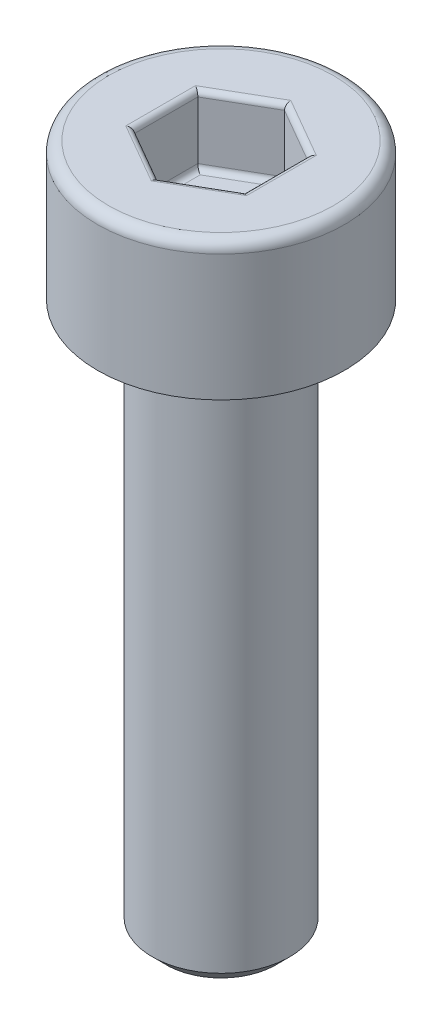
ISO-10303-21;
HEADER;
FILE_DESCRIPTION(('STEP AP214'),'2;1');
FILE_NAME('part.step','',(''),(''),'','','');
FILE_SCHEMA(('AUTOMOTIVE_DESIGN { 1 0 10303 214 1 1 1 1 }'));
ENDSEC;
DATA;
#1=APPLICATION_CONTEXT('core data for automotive mechanical design processes');
#2=APPLICATION_PROTOCOL_DEFINITION('international standard','automotive_design',2000,#1);
#3=PRODUCT_CONTEXT('',#1,'mechanical');
#4=PRODUCT('Part','Part','',(#3));
#5=PRODUCT_RELATED_PRODUCT_CATEGORY('part','',(#4));
#6=PRODUCT_DEFINITION_FORMATION('','',#4);
#7=PRODUCT_DEFINITION_CONTEXT('part definition',#1,'design');
#8=PRODUCT_DEFINITION('design','',#6,#7);
#9=PRODUCT_DEFINITION_SHAPE('','',#8);
#10=(LENGTH_UNIT() NAMED_UNIT(*) SI_UNIT(.MILLI.,.METRE.));
#11=(NAMED_UNIT(*) PLANE_ANGLE_UNIT() SI_UNIT($,.RADIAN.));
#12=(NAMED_UNIT(*) SI_UNIT($,.STERADIAN.) SOLID_ANGLE_UNIT());
#13=UNCERTAINTY_MEASURE_WITH_UNIT(LENGTH_MEASURE(1.E-05),#10,'distance_accuracy_value','');
#14=(GEOMETRIC_REPRESENTATION_CONTEXT(3) GLOBAL_UNCERTAINTY_ASSIGNED_CONTEXT((#13)) GLOBAL_UNIT_ASSIGNED_CONTEXT((#10,
#11,#12)) REPRESENTATION_CONTEXT('',''));
#15=CARTESIAN_POINT('',(0.,0.,0.));
#16=DIRECTION('',(0.,0.,1.));
#17=DIRECTION('',(1.,0.,0.));
#18=AXIS2_PLACEMENT_3D('',#15,#16,#17);
#19=CARTESIAN_POINT('',(0.,-12.5,0.));
#20=DIRECTION('',(0.,-1.,0.));
#21=DIRECTION('',(0.,0.,-1.));
#22=AXIS2_PLACEMENT_3D('',#19,#20,#21);
#23=PLANE('',#22);
#24=CARTESIAN_POINT('',(0.,-12.5,0.));
#25=DIRECTION('',(0.,-1.,0.));
#26=DIRECTION('',(0.,0.,-1.));
#27=AXIS2_PLACEMENT_3D('',#24,#25,#26);
#28=CIRCLE('',#27,0.999999999999992);
#29=CARTESIAN_POINT('',(0.,-12.5,-0.999999999999992));
#30=VERTEX_POINT('',#29);
#31=EDGE_CURVE('E262',#30,#30,#28,.T.);
#32=ORIENTED_EDGE('',*,*,#31,.T.);
#33=EDGE_LOOP('',(#32));
#34=FACE_BOUND('',#33,.T.);
#35=ADVANCED_FACE('F34',(#34),#23,.T.);
#36=CARTESIAN_POINT('',(0.,0.,0.));
#37=DIRECTION('',(0.,1.,0.));
#38=DIRECTION('',(0.,0.,1.));
#39=AXIS2_PLACEMENT_3D('',#36,#37,#38);
#40=CYLINDRICAL_SURFACE('',#39,1.25);
#41=CARTESIAN_POINT('',(0.,-2.75,0.));
#42=DIRECTION('',(0.,-1.,0.));
#43=DIRECTION('',(0.,0.,-1.));
#44=AXIS2_PLACEMENT_3D('',#41,#42,#43);
#45=CIRCLE('',#44,1.25);
#46=CARTESIAN_POINT('',(0.,-2.75,-1.25));
#47=VERTEX_POINT('',#46);
#48=EDGE_CURVE('E259',#47,#47,#45,.T.);
#49=ORIENTED_EDGE('',*,*,#48,.T.);
#50=EDGE_LOOP('',(#49));
#51=FACE_BOUND('',#50,.T.);
#52=CARTESIAN_POINT('',(0.,-12.25,0.));
#53=DIRECTION('',(0.,-1.,0.));
#54=DIRECTION('',(0.,0.,-1.));
#55=AXIS2_PLACEMENT_3D('',#52,#53,#54);
#56=CIRCLE('',#55,1.25);
#57=CARTESIAN_POINT('',(0.,-12.25,-1.25));
#58=VERTEX_POINT('',#57);
#59=EDGE_CURVE('E256',#58,#58,#56,.F.);
#60=ORIENTED_EDGE('',*,*,#59,.T.);
#61=EDGE_LOOP('',(#60));
#62=FACE_BOUND('',#61,.T.);
#63=ADVANCED_FACE('F288',(#51,#62),#40,.T.);
#64=CARTESIAN_POINT('',(-1.25,-2.5,0.));
#65=DIRECTION('',(0.,-1.,0.));
#66=DIRECTION('',(0.,0.,-1.));
#67=AXIS2_PLACEMENT_3D('',#64,#65,#66);
#68=PLANE('',#67);
#69=CARTESIAN_POINT('',(0.,-2.5,0.));
#70=DIRECTION('',(0.,-1.,0.));
#71=DIRECTION('',(0.,0.,-1.));
#72=AXIS2_PLACEMENT_3D('',#69,#70,#71);
#73=CIRCLE('',#72,1.5);
#74=CARTESIAN_POINT('',(0.,-2.5,-1.5));
#75=VERTEX_POINT('',#74);
#76=EDGE_CURVE('E253',#75,#75,#73,.F.);
#77=ORIENTED_EDGE('',*,*,#76,.T.);
#78=EDGE_LOOP('',(#77));
#79=FACE_BOUND('',#78,.T.);
#80=CARTESIAN_POINT('',(0.,-2.5,0.));
#81=DIRECTION('',(0.,1.,0.));
#82=DIRECTION('',(0.,0.,1.));
#83=AXIS2_PLACEMENT_3D('',#80,#81,#82);
#84=CIRCLE('',#83,2.25);
#85=CARTESIAN_POINT('',(0.,-2.5,2.25));
#86=VERTEX_POINT('',#85);
#87=EDGE_CURVE('E250',#86,#86,#84,.T.);
#88=ORIENTED_EDGE('',*,*,#87,.F.);
#89=EDGE_LOOP('',(#88));
#90=FACE_BOUND('',#89,.T.);
#91=ADVANCED_FACE('F294',(#79,#90),#68,.T.);
#92=CARTESIAN_POINT('',(0.,0.,0.));
#93=DIRECTION('',(0.,1.,0.));
#94=DIRECTION('',(0.,0.,1.));
#95=AXIS2_PLACEMENT_3D('',#92,#93,#94);
#96=CYLINDRICAL_SURFACE('',#95,2.25);
#97=CARTESIAN_POINT('',(0.,-0.2,0.));
#98=DIRECTION('',(0.,1.,0.));
#99=DIRECTION('',(0.,0.,1.));
#100=AXIS2_PLACEMENT_3D('',#97,#98,#99);
#101=CIRCLE('',#100,2.25);
#102=CARTESIAN_POINT('',(0.,-0.2,2.25));
#103=VERTEX_POINT('',#102);
#104=EDGE_CURVE('E160',#103,#103,#101,.F.);
#105=ORIENTED_EDGE('',*,*,#104,.T.);
#106=EDGE_LOOP('',(#105));
#107=FACE_BOUND('',#106,.T.);
#108=ORIENTED_EDGE('',*,*,#87,.T.);
#109=EDGE_LOOP('',(#108));
#110=FACE_BOUND('',#109,.T.);
#111=ADVANCED_FACE('F304',(#107,#110),#96,.T.);
#112=CARTESIAN_POINT('',(-2.25,0.,0.));
#113=DIRECTION('',(0.,1.,0.));
#114=DIRECTION('',(0.,0.,1.));
#115=AXIS2_PLACEMENT_3D('',#112,#113,#114);
#116=PLANE('',#115);
#117=DIRECTION('',(0.,0.,1.));
#118=VECTOR('',#117,1.);
#119=CARTESIAN_POINT('',(-1.1,0.,-0.577350269189627));
#120=LINE('',#119,#118);
#121=CARTESIAN_POINT('',(-1.1,0.,0.635085296108588));
#122=VERTEX_POINT('',#121);
#123=CARTESIAN_POINT('',(-1.1,0.,-0.635085296108589));
#124=VERTEX_POINT('',#123);
#125=EDGE_CURVE('E176',#122,#124,#120,.F.);
#126=ORIENTED_EDGE('',*,*,#125,.T.);
#127=DIRECTION('',(-0.866025403784439,0.,0.5));
#128=VECTOR('',#127,1.);
#129=CARTESIAN_POINT('',(-0.0500000000000009,0.,-1.2413030787577));
#130=LINE('',#129,#128);
#131=CARTESIAN_POINT('',(0.,0.,-1.27017059221718));
#132=VERTEX_POINT('',#131);
#133=EDGE_CURVE('E135',#124,#132,#130,.F.);
#134=ORIENTED_EDGE('',*,*,#133,.T.);
#135=DIRECTION('',(-0.866025403784439,0.,-0.5));
#136=VECTOR('',#135,1.);
#137=CARTESIAN_POINT('',(1.05,0.,-0.663952809568071));
#138=LINE('',#137,#136);
#139=CARTESIAN_POINT('',(1.1,0.,-0.63508529610859));
#140=VERTEX_POINT('',#139);
#141=EDGE_CURVE('E162',#132,#140,#138,.F.);
#142=ORIENTED_EDGE('',*,*,#141,.T.);
#143=DIRECTION('',(0.,0.,-1.));
#144=VECTOR('',#143,1.);
#145=CARTESIAN_POINT('',(1.1,0.,0.577350269189625));
#146=LINE('',#145,#144);
#147=CARTESIAN_POINT('',(1.1,0.,0.635085296108588));
#148=VERTEX_POINT('',#147);
#149=EDGE_CURVE('E170',#140,#148,#146,.F.);
#150=ORIENTED_EDGE('',*,*,#149,.T.);
#151=DIRECTION('',(0.866025403784439,0.,-0.5));
#152=VECTOR('',#151,1.);
#153=CARTESIAN_POINT('',(0.0499999999999991,0.,1.24130307875769));
#154=LINE('',#153,#152);
#155=CARTESIAN_POINT('',(0.,0.,1.27017059221718));
#156=VERTEX_POINT('',#155);
#157=EDGE_CURVE('E172',#148,#156,#154,.F.);
#158=ORIENTED_EDGE('',*,*,#157,.T.);
#159=DIRECTION('',(0.866025403784439,0.,0.5));
#160=VECTOR('',#159,1.);
#161=CARTESIAN_POINT('',(-1.05,0.,0.663952809568069));
#162=LINE('',#161,#160);
#163=EDGE_CURVE('E174',#156,#122,#162,.F.);
#164=ORIENTED_EDGE('',*,*,#163,.T.);
#165=EDGE_LOOP('',(#126,#134,#142,#150,#158,#164));
#166=FACE_BOUND('',#165,.T.);
#167=CARTESIAN_POINT('',(0.,0.,0.));
#168=DIRECTION('',(0.,1.,0.));
#169=DIRECTION('',(0.,0.,1.));
#170=AXIS2_PLACEMENT_3D('',#167,#168,#169);
#171=CIRCLE('',#170,2.05);
#172=CARTESIAN_POINT('',(0.,0.,2.05));
#173=VERTEX_POINT('',#172);
#174=EDGE_CURVE('E165',#173,#173,#171,.T.);
#175=ORIENTED_EDGE('',*,*,#174,.T.);
#176=EDGE_LOOP('',(#175));
#177=FACE_BOUND('',#176,.T.);
#178=ADVANCED_FACE('F267',(#166,#177),#116,.T.);
#179=CARTESIAN_POINT('',(0.,-2.5,0.));
#180=DIRECTION('',(0.,1.,0.));
#181=DIRECTION('',(0.,0.,1.));
#182=AXIS2_PLACEMENT_3D('',#179,#180,#181);
#183=CONICAL_SURFACE('',#182,1.5,0.785398163397458);
#184=ORIENTED_EDGE('',*,*,#48,.F.);
#185=EDGE_LOOP('',(#184));
#186=FACE_BOUND('',#185,.T.);
#187=ORIENTED_EDGE('',*,*,#76,.F.);
#188=EDGE_LOOP('',(#187));
#189=FACE_BOUND('',#188,.T.);
#190=ADVANCED_FACE('F282',(#186,#189),#183,.T.);
#191=CARTESIAN_POINT('',(0.,-12.25,0.));
#192=DIRECTION('',(0.,1.,0.));
#193=DIRECTION('',(0.,0.,1.));
#194=AXIS2_PLACEMENT_3D('',#191,#192,#193);
#195=CONICAL_SURFACE('',#194,1.25,0.785398163397454);
#196=ORIENTED_EDGE('',*,*,#31,.F.);
#197=EDGE_LOOP('',(#196));
#198=FACE_BOUND('',#197,.T.);
#199=ORIENTED_EDGE('',*,*,#59,.F.);
#200=EDGE_LOOP('',(#199));
#201=FACE_BOUND('',#200,.T.);
#202=ADVANCED_FACE('F272',(#198,#201),#195,.T.);
#203=CARTESIAN_POINT('',(0.,-0.2,0.));
#204=DIRECTION('',(0.,1.,0.));
#205=DIRECTION('',(0.,0.,1.));
#206=AXIS2_PLACEMENT_3D('',#203,#204,#205);
#207=TOROIDAL_SURFACE('',#206,2.05,0.2);
#208=ORIENTED_EDGE('',*,*,#104,.F.);
#209=EDGE_LOOP('',(#208));
#210=FACE_BOUND('',#209,.T.);
#211=ORIENTED_EDGE('',*,*,#174,.F.);
#212=EDGE_LOOP('',(#211));
#213=FACE_BOUND('',#212,.T.);
#214=ADVANCED_FACE('F269',(#210,#213),#207,.T.);
#215=CARTESIAN_POINT('',(0.999999999999998,-1.25,-0.577350269189627));
#216=DIRECTION('',(0.5,0.,-0.866025403784439));
#217=DIRECTION('',(-0.866025403784439,0.,-0.5));
#218=AXIS2_PLACEMENT_3D('',#215,#216,#217);
#219=PLANE('',#218);
#220=DIRECTION('',(0.,1.,0.));
#221=VECTOR('',#220,1.);
#222=CARTESIAN_POINT('',(0.999999999999998,-1.25,-0.577350269189627));
#223=LINE('',#222,#221);
#224=CARTESIAN_POINT('',(0.999999999999998,-1.15,-0.577350269189627));
#225=VERTEX_POINT('',#224);
#226=CARTESIAN_POINT('',(0.999999999999998,-0.1,-0.577350269189627));
#227=VERTEX_POINT('',#226);
#228=EDGE_CURVE('E244',#225,#227,#223,.T.);
#229=ORIENTED_EDGE('',*,*,#228,.T.);
#230=DIRECTION('',(-0.866025403784439,0.,-0.5));
#231=VECTOR('',#230,1.);
#232=CARTESIAN_POINT('',(0.,-0.1,-1.15470053837925));
#233=LINE('',#232,#231);
#234=CARTESIAN_POINT('',(0.,-0.1,-1.15470053837925));
#235=VERTEX_POINT('',#234);
#236=EDGE_CURVE('E196',#227,#235,#233,.T.);
#237=ORIENTED_EDGE('',*,*,#236,.T.);
#238=DIRECTION('',(0.,1.,0.));
#239=VECTOR('',#238,1.);
#240=CARTESIAN_POINT('',(0.,-1.25,-1.15470053837925));
#241=LINE('',#240,#239);
#242=CARTESIAN_POINT('',(0.,-1.15,-1.15470053837925));
#243=VERTEX_POINT('',#242);
#244=EDGE_CURVE('E146',#243,#235,#241,.T.);
#245=ORIENTED_EDGE('',*,*,#244,.F.);
#246=DIRECTION('',(-0.866025403784439,0.,-0.5));
#247=VECTOR('',#246,1.);
#248=CARTESIAN_POINT('',(0.999999999999998,-1.15,-0.577350269189627));
#249=LINE('',#248,#247);
#250=EDGE_CURVE('E194',#243,#225,#249,.F.);
#251=ORIENTED_EDGE('',*,*,#250,.T.);
#252=EDGE_LOOP('',(#229,#237,#245,#251));
#253=FACE_BOUND('',#252,.T.);
#254=ADVANCED_FACE('F271',(#253),#219,.F.);
#255=CARTESIAN_POINT('',(0.999999999999999,-1.25,0.577350269189625));
#256=DIRECTION('',(1.,0.,0.));
#257=DIRECTION('',(0.,0.,-1.));
#258=AXIS2_PLACEMENT_3D('',#255,#256,#257);
#259=PLANE('',#258);
#260=DIRECTION('',(0.,1.,0.));
#261=VECTOR('',#260,1.);
#262=CARTESIAN_POINT('',(0.999999999999999,-1.25,0.577350269189625));
#263=LINE('',#262,#261);
#264=CARTESIAN_POINT('',(0.999999999999999,-1.15,0.577350269189625));
#265=VERTEX_POINT('',#264);
#266=CARTESIAN_POINT('',(0.999999999999999,-0.1,0.577350269189625));
#267=VERTEX_POINT('',#266);
#268=EDGE_CURVE('E241',#265,#267,#263,.T.);
#269=ORIENTED_EDGE('',*,*,#268,.T.);
#270=DIRECTION('',(0.,0.,-1.));
#271=VECTOR('',#270,1.);
#272=CARTESIAN_POINT('',(0.999999999999998,-0.1,-0.577350269189627));
#273=LINE('',#272,#271);
#274=EDGE_CURVE('E192',#267,#227,#273,.T.);
#275=ORIENTED_EDGE('',*,*,#274,.T.);
#276=ORIENTED_EDGE('',*,*,#228,.F.);
#277=DIRECTION('',(0.,0.,-1.));
#278=VECTOR('',#277,1.);
#279=CARTESIAN_POINT('',(0.999999999999999,-1.15,0.577350269189625));
#280=LINE('',#279,#278);
#281=EDGE_CURVE('E189',#225,#265,#280,.F.);
#282=ORIENTED_EDGE('',*,*,#281,.T.);
#283=EDGE_LOOP('',(#269,#275,#276,#282));
#284=FACE_BOUND('',#283,.T.);
#285=ADVANCED_FACE('F279',(#284),#259,.F.);
#286=CARTESIAN_POINT('',(0.,-1.25,1.15470053837925));
#287=DIRECTION('',(0.5,0.,0.866025403784439));
#288=DIRECTION('',(0.866025403784439,0.,-0.5));
#289=AXIS2_PLACEMENT_3D('',#286,#287,#288);
#290=PLANE('',#289);
#291=DIRECTION('',(0.,1.,0.));
#292=VECTOR('',#291,1.);
#293=CARTESIAN_POINT('',(0.,-1.25,1.15470053837925));
#294=LINE('',#293,#292);
#295=CARTESIAN_POINT('',(0.,-1.15,1.15470053837925));
#296=VERTEX_POINT('',#295);
#297=CARTESIAN_POINT('',(0.,-0.1,1.15470053837925));
#298=VERTEX_POINT('',#297);
#299=EDGE_CURVE('E238',#296,#298,#294,.T.);
#300=ORIENTED_EDGE('',*,*,#299,.T.);
#301=DIRECTION('',(0.866025403784439,0.,-0.5));
#302=VECTOR('',#301,1.);
#303=CARTESIAN_POINT('',(0.999999999999999,-0.1,0.577350269189625));
#304=LINE('',#303,#302);
#305=EDGE_CURVE('E187',#298,#267,#304,.T.);
#306=ORIENTED_EDGE('',*,*,#305,.T.);
#307=ORIENTED_EDGE('',*,*,#268,.F.);
#308=DIRECTION('',(0.866025403784439,0.,-0.5));
#309=VECTOR('',#308,1.);
#310=CARTESIAN_POINT('',(0.,-1.15,1.15470053837925));
#311=LINE('',#310,#309);
#312=EDGE_CURVE('E185',#265,#296,#311,.F.);
#313=ORIENTED_EDGE('',*,*,#312,.T.);
#314=EDGE_LOOP('',(#300,#306,#307,#313));
#315=FACE_BOUND('',#314,.T.);
#316=ADVANCED_FACE('F328',(#315),#290,.F.);
#317=CARTESIAN_POINT('',(-1.,-1.25,0.577350269189625));
#318=DIRECTION('',(-0.5,0.,0.866025403784438));
#319=DIRECTION('',(0.866025403784439,0.,0.5));
#320=AXIS2_PLACEMENT_3D('',#317,#318,#319);
#321=PLANE('',#320);
#322=DIRECTION('',(0.,1.,0.));
#323=VECTOR('',#322,1.);
#324=CARTESIAN_POINT('',(-1.,-1.25,0.577350269189625));
#325=LINE('',#324,#323);
#326=CARTESIAN_POINT('',(-1.,-1.15,0.577350269189625));
#327=VERTEX_POINT('',#326);
#328=CARTESIAN_POINT('',(-1.,-0.1,0.577350269189625));
#329=VERTEX_POINT('',#328);
#330=EDGE_CURVE('E129',#327,#329,#325,.T.);
#331=ORIENTED_EDGE('',*,*,#330,.T.);
#332=DIRECTION('',(0.866025403784439,0.,0.5));
#333=VECTOR('',#332,1.);
#334=CARTESIAN_POINT('',(0.,-0.1,1.15470053837925));
#335=LINE('',#334,#333);
#336=EDGE_CURVE('E183',#329,#298,#335,.T.);
#337=ORIENTED_EDGE('',*,*,#336,.T.);
#338=ORIENTED_EDGE('',*,*,#299,.F.);
#339=DIRECTION('',(0.866025403784439,0.,0.5));
#340=VECTOR('',#339,1.);
#341=CARTESIAN_POINT('',(-1.,-1.15,0.577350269189625));
#342=LINE('',#341,#340);
#343=EDGE_CURVE('E181',#296,#327,#342,.F.);
#344=ORIENTED_EDGE('',*,*,#343,.T.);
#345=EDGE_LOOP('',(#331,#337,#338,#344));
#346=FACE_BOUND('',#345,.T.);
#347=ADVANCED_FACE('F235',(#346),#321,.F.);
#348=CARTESIAN_POINT('',(-1.,-1.25,-0.577350269189627));
#349=DIRECTION('',(-1.,0.,0.));
#350=DIRECTION('',(0.,0.,1.));
#351=AXIS2_PLACEMENT_3D('',#348,#349,#350);
#352=PLANE('',#351);
#353=DIRECTION('',(0.,1.,0.));
#354=VECTOR('',#353,1.);
#355=CARTESIAN_POINT('',(-1.,-1.25,-0.577350269189627));
#356=LINE('',#355,#354);
#357=CARTESIAN_POINT('',(-1.,-1.15,-0.577350269189627));
#358=VERTEX_POINT('',#357);
#359=CARTESIAN_POINT('',(-1.,-0.1,-0.577350269189627));
#360=VERTEX_POINT('',#359);
#361=EDGE_CURVE('E127',#358,#360,#356,.T.);
#362=ORIENTED_EDGE('',*,*,#361,.T.);
#363=DIRECTION('',(0.,0.,1.));
#364=VECTOR('',#363,1.);
#365=CARTESIAN_POINT('',(-1.,-0.1,0.577350269189625));
#366=LINE('',#365,#364);
#367=EDGE_CURVE('E134',#360,#329,#366,.T.);
#368=ORIENTED_EDGE('',*,*,#367,.T.);
#369=ORIENTED_EDGE('',*,*,#330,.F.);
#370=DIRECTION('',(0.,0.,1.));
#371=VECTOR('',#370,1.);
#372=CARTESIAN_POINT('',(-1.,-1.15,-0.577350269189627));
#373=LINE('',#372,#371);
#374=EDGE_CURVE('E124',#327,#358,#373,.F.);
#375=ORIENTED_EDGE('',*,*,#374,.T.);
#376=EDGE_LOOP('',(#362,#368,#369,#375));
#377=FACE_BOUND('',#376,.T.);
#378=ADVANCED_FACE('F126',(#377),#352,.F.);
#379=CARTESIAN_POINT('',(0.,-1.25,-1.15470053837925));
#380=DIRECTION('',(-0.5,0.,-0.866025403784438));
#381=DIRECTION('',(-0.866025403784439,0.,0.5));
#382=AXIS2_PLACEMENT_3D('',#379,#380,#381);
#383=PLANE('',#382);
#384=ORIENTED_EDGE('',*,*,#244,.T.);
#385=DIRECTION('',(-0.866025403784439,0.,0.5));
#386=VECTOR('',#385,1.);
#387=CARTESIAN_POINT('',(-1.,-0.1,-0.577350269189626));
#388=LINE('',#387,#386);
#389=EDGE_CURVE('E145',#235,#360,#388,.T.);
#390=ORIENTED_EDGE('',*,*,#389,.T.);
#391=ORIENTED_EDGE('',*,*,#361,.F.);
#392=DIRECTION('',(-0.866025403784439,0.,0.5));
#393=VECTOR('',#392,1.);
#394=CARTESIAN_POINT('',(0.,-1.15,-1.15470053837925));
#395=LINE('',#394,#393);
#396=EDGE_CURVE('E142',#358,#243,#395,.F.);
#397=ORIENTED_EDGE('',*,*,#396,.T.);
#398=EDGE_LOOP('',(#384,#390,#391,#397));
#399=FACE_BOUND('',#398,.T.);
#400=ADVANCED_FACE('F140',(#399),#383,.F.);
#401=CARTESIAN_POINT('',(0.,-1.25,-1.15470053837925));
#402=DIRECTION('',(0.,1.,0.));
#403=DIRECTION('',(0.,0.,1.));
#404=AXIS2_PLACEMENT_3D('',#401,#402,#403);
#405=PLANE('',#404);
#406=DIRECTION('',(0.866025403784439,0.,-0.5));
#407=VECTOR('',#406,1.);
#408=CARTESIAN_POINT('',(0.949999999999999,-1.25,0.490747728811181));
#409=LINE('',#408,#407);
#410=CARTESIAN_POINT('',(0.,-1.25,1.03923048454133));
#411=VERTEX_POINT('',#410);
#412=CARTESIAN_POINT('',(0.899999999999999,-1.25,0.519615242270663));
#413=VERTEX_POINT('',#412);
#414=EDGE_CURVE('E43',#411,#413,#409,.T.);
#415=ORIENTED_EDGE('',*,*,#414,.T.);
#416=DIRECTION('',(0.,0.,-1.));
#417=VECTOR('',#416,1.);
#418=CARTESIAN_POINT('',(0.899999999999998,-1.25,-1.15470053837925));
#419=LINE('',#418,#417);
#420=CARTESIAN_POINT('',(0.899999999999998,-1.25,-0.519615242270664));
#421=VERTEX_POINT('',#420);
#422=EDGE_CURVE('E11',#413,#421,#419,.T.);
#423=ORIENTED_EDGE('',*,*,#422,.T.);
#424=DIRECTION('',(-0.866025403784439,0.,-0.5));
#425=VECTOR('',#424,1.);
#426=CARTESIAN_POINT('',(-0.0500000000000008,-1.25,-1.06809799800081));
#427=LINE('',#426,#425);
#428=CARTESIAN_POINT('',(0.,-1.25,-1.03923048454133));
#429=VERTEX_POINT('',#428);
#430=EDGE_CURVE('E198',#421,#429,#427,.T.);
#431=ORIENTED_EDGE('',*,*,#430,.T.);
#432=DIRECTION('',(-0.866025403784439,0.,0.5));
#433=VECTOR('',#432,1.);
#434=CARTESIAN_POINT('',(0.0499999999999993,-1.25,-1.06809799800081));
#435=LINE('',#434,#433);
#436=CARTESIAN_POINT('',(-0.9,-1.25,-0.519615242270664));
#437=VERTEX_POINT('',#436);
#438=EDGE_CURVE('E200',#429,#437,#435,.T.);
#439=ORIENTED_EDGE('',*,*,#438,.T.);
#440=DIRECTION('',(0.,0.,1.));
#441=VECTOR('',#440,1.);
#442=CARTESIAN_POINT('',(-0.9,-1.25,-1.15470053837925));
#443=LINE('',#442,#441);
#444=CARTESIAN_POINT('',(-0.9,-1.25,0.519615242270662));
#445=VERTEX_POINT('',#444);
#446=EDGE_CURVE('E151',#437,#445,#443,.T.);
#447=ORIENTED_EDGE('',*,*,#446,.T.);
#448=DIRECTION('',(0.866025403784439,0.,0.5));
#449=VECTOR('',#448,1.);
#450=CARTESIAN_POINT('',(-0.950000000000001,-1.25,0.490747728811181));
#451=LINE('',#450,#449);
#452=EDGE_CURVE('E54',#445,#411,#451,.T.);
#453=ORIENTED_EDGE('',*,*,#452,.T.);
#454=EDGE_LOOP('',(#415,#423,#431,#439,#447,#453));
#455=FACE_BOUND('',#454,.T.);
#456=ADVANCED_FACE('F323',(#455),#405,.T.);
#457=CARTESIAN_POINT('',(0.0499999999999991,-0.1,1.24130307875769));
#458=DIRECTION('',(-0.866025403784439,0.,0.5));
#459=DIRECTION('',(0.5,0.,0.866025403784439));
#460=AXIS2_PLACEMENT_3D('',#457,#458,#459);
#461=CYLINDRICAL_SURFACE('',#460,0.1);
#462=CARTESIAN_POINT('',(0.,-0.1,1.27017059221718));
#463=DIRECTION('',(-1.,0.,0.));
#464=DIRECTION('',(0.,0.,-1.));
#465=AXIS2_PLACEMENT_3D('',#462,#463,#464);
#466=ELLIPSE('',#465,0.115470053837925,0.1);
#467=EDGE_CURVE('E215',#156,#298,#466,.T.);
#468=ORIENTED_EDGE('',*,*,#467,.F.);
#469=ORIENTED_EDGE('',*,*,#157,.F.);
#470=CARTESIAN_POINT('',(1.1,-0.1,0.635085296108588));
#471=DIRECTION('',(-0.5,0.,0.866025403784439));
#472=DIRECTION('',(-0.866025403784439,0.,-0.5));
#473=AXIS2_PLACEMENT_3D('',#470,#471,#472);
#474=ELLIPSE('',#473,0.115470053837925,0.1);
#475=EDGE_CURVE('E218',#267,#148,#474,.F.);
#476=ORIENTED_EDGE('',*,*,#475,.F.);
#477=ORIENTED_EDGE('',*,*,#305,.F.);
#478=EDGE_LOOP('',(#468,#469,#476,#477));
#479=FACE_BOUND('',#478,.T.);
#480=ADVANCED_FACE('F335',(#479),#461,.T.);
#481=CARTESIAN_POINT('',(1.1,-0.1,0.577350269189625));
#482=DIRECTION('',(0.,0.,1.));
#483=DIRECTION('',(1.,0.,0.));
#484=AXIS2_PLACEMENT_3D('',#481,#482,#483);
#485=CYLINDRICAL_SURFACE('',#484,0.1);
#486=ORIENTED_EDGE('',*,*,#475,.T.);
#487=ORIENTED_EDGE('',*,*,#149,.F.);
#488=CARTESIAN_POINT('',(1.1,-0.1,-0.63508529610859));
#489=DIRECTION('',(0.5,0.,0.866025403784439));
#490=DIRECTION('',(-0.866025403784439,0.,0.5));
#491=AXIS2_PLACEMENT_3D('',#488,#489,#490);
#492=ELLIPSE('',#491,0.115470053837925,0.1);
#493=EDGE_CURVE('E212',#227,#140,#492,.F.);
#494=ORIENTED_EDGE('',*,*,#493,.F.);
#495=ORIENTED_EDGE('',*,*,#274,.F.);
#496=EDGE_LOOP('',(#486,#487,#494,#495));
#497=FACE_BOUND('',#496,.T.);
#498=ADVANCED_FACE('F339',(#497),#485,.T.);
#499=CARTESIAN_POINT('',(-1.05,-0.1,0.663952809568069));
#500=DIRECTION('',(-0.866025403784439,0.,-0.5));
#501=DIRECTION('',(-0.5,0.,0.866025403784438));
#502=AXIS2_PLACEMENT_3D('',#499,#500,#501);
#503=CYLINDRICAL_SURFACE('',#502,0.1);
#504=ORIENTED_EDGE('',*,*,#467,.T.);
#505=ORIENTED_EDGE('',*,*,#336,.F.);
#506=CARTESIAN_POINT('',(-1.1,-0.1,0.635085296108587));
#507=DIRECTION('',(-0.5,0.,-0.866025403784439));
#508=DIRECTION('',(0.866025403784439,0.,-0.5));
#509=AXIS2_PLACEMENT_3D('',#506,#507,#508);
#510=ELLIPSE('',#509,0.115470053837925,0.1);
#511=EDGE_CURVE('E209',#122,#329,#510,.T.);
#512=ORIENTED_EDGE('',*,*,#511,.F.);
#513=ORIENTED_EDGE('',*,*,#163,.F.);
#514=EDGE_LOOP('',(#504,#505,#512,#513));
#515=FACE_BOUND('',#514,.T.);
#516=ADVANCED_FACE('F345',(#515),#503,.T.);
#517=CARTESIAN_POINT('',(1.05,-0.1,-0.663952809568071));
#518=DIRECTION('',(0.866025403784439,0.,0.5));
#519=DIRECTION('',(0.5,0.,-0.866025403784439));
#520=AXIS2_PLACEMENT_3D('',#517,#518,#519);
#521=CYLINDRICAL_SURFACE('',#520,0.1);
#522=ORIENTED_EDGE('',*,*,#493,.T.);
#523=ORIENTED_EDGE('',*,*,#141,.F.);
#524=CARTESIAN_POINT('',(0.,-0.1,-1.27017059221718));
#525=DIRECTION('',(1.,0.,0.));
#526=DIRECTION('',(0.,0.,-1.));
#527=AXIS2_PLACEMENT_3D('',#524,#525,#526);
#528=ELLIPSE('',#527,0.115470053837925,0.1);
#529=EDGE_CURVE('E207',#235,#132,#528,.F.);
#530=ORIENTED_EDGE('',*,*,#529,.F.);
#531=ORIENTED_EDGE('',*,*,#236,.F.);
#532=EDGE_LOOP('',(#522,#523,#530,#531));
#533=FACE_BOUND('',#532,.T.);
#534=ADVANCED_FACE('F375',(#533),#521,.T.);
#535=CARTESIAN_POINT('',(-1.1,-0.1,-0.577350269189627));
#536=DIRECTION('',(0.,0.,-1.));
#537=DIRECTION('',(-1.,0.,0.));
#538=AXIS2_PLACEMENT_3D('',#535,#536,#537);
#539=CYLINDRICAL_SURFACE('',#538,0.1);
#540=ORIENTED_EDGE('',*,*,#511,.T.);
#541=ORIENTED_EDGE('',*,*,#367,.F.);
#542=CARTESIAN_POINT('',(-1.1,-0.1,-0.635085296108589));
#543=DIRECTION('',(0.5,0.,-0.866025403784439));
#544=DIRECTION('',(0.866025403784439,0.,0.5));
#545=AXIS2_PLACEMENT_3D('',#542,#543,#544);
#546=ELLIPSE('',#545,0.115470053837925,0.1);
#547=EDGE_CURVE('E205',#124,#360,#546,.T.);
#548=ORIENTED_EDGE('',*,*,#547,.F.);
#549=ORIENTED_EDGE('',*,*,#125,.F.);
#550=EDGE_LOOP('',(#540,#541,#548,#549));
#551=FACE_BOUND('',#550,.T.);
#552=ADVANCED_FACE('F370',(#551),#539,.T.);
#553=CARTESIAN_POINT('',(-0.0500000000000009,-0.1,-1.2413030787577));
#554=DIRECTION('',(0.866025403784439,0.,-0.5));
#555=DIRECTION('',(-0.5,0.,-0.866025403784438));
#556=AXIS2_PLACEMENT_3D('',#553,#554,#555);
#557=CYLINDRICAL_SURFACE('',#556,0.1);
#558=ORIENTED_EDGE('',*,*,#529,.T.);
#559=ORIENTED_EDGE('',*,*,#133,.F.);
#560=ORIENTED_EDGE('',*,*,#547,.T.);
#561=ORIENTED_EDGE('',*,*,#389,.F.);
#562=EDGE_LOOP('',(#558,#559,#560,#561));
#563=FACE_BOUND('',#562,.T.);
#564=ADVANCED_FACE('F366',(#563),#557,.T.);
#565=CARTESIAN_POINT('',(-0.9,-1.15,-1.15470053837925));
#566=DIRECTION('',(0.,0.,1.));
#567=DIRECTION('',(1.,0.,0.));
#568=AXIS2_PLACEMENT_3D('',#565,#566,#567);
#569=CYLINDRICAL_SURFACE('',#568,0.1);
#570=CARTESIAN_POINT('',(-0.900000000000001,-1.15,-0.519615242270664));
#571=DIRECTION('',(-0.5,0.,0.866025403784439));
#572=DIRECTION('',(0.866025403784439,0.,0.5));
#573=AXIS2_PLACEMENT_3D('',#570,#571,#572);
#574=ELLIPSE('',#573,0.115470053837925,0.1);
#575=EDGE_CURVE('E150',#358,#437,#574,.T.);
#576=ORIENTED_EDGE('',*,*,#575,.F.);
#577=ORIENTED_EDGE('',*,*,#374,.F.);
#578=CARTESIAN_POINT('',(-0.9,-1.15,0.519615242270662));
#579=DIRECTION('',(0.5,0.,0.866025403784439));
#580=DIRECTION('',(0.866025403784439,0.,-0.5));
#581=AXIS2_PLACEMENT_3D('',#578,#579,#580);
#582=ELLIPSE('',#581,0.115470053837925,0.1);
#583=EDGE_CURVE('E38',#445,#327,#582,.F.);
#584=ORIENTED_EDGE('',*,*,#583,.F.);
#585=ORIENTED_EDGE('',*,*,#446,.F.);
#586=EDGE_LOOP('',(#576,#577,#584,#585));
#587=FACE_BOUND('',#586,.T.);
#588=ADVANCED_FACE('F36',(#587),#569,.F.);
#589=CARTESIAN_POINT('',(-0.950000000000001,-1.15,0.490747728811181));
#590=DIRECTION('',(0.866025403784439,0.,0.5));
#591=DIRECTION('',(0.5,0.,-0.866025403784438));
#592=AXIS2_PLACEMENT_3D('',#589,#590,#591);
#593=CYLINDRICAL_SURFACE('',#592,0.1);
#594=ORIENTED_EDGE('',*,*,#583,.T.);
#595=ORIENTED_EDGE('',*,*,#343,.F.);
#596=CARTESIAN_POINT('',(0.,-1.15,1.03923048454133));
#597=DIRECTION('',(1.,0.,0.));
#598=DIRECTION('',(0.,0.,-1.));
#599=AXIS2_PLACEMENT_3D('',#596,#597,#598);
#600=ELLIPSE('',#599,0.115470053837925,0.1);
#601=EDGE_CURVE('E154',#411,#296,#600,.F.);
#602=ORIENTED_EDGE('',*,*,#601,.F.);
#603=ORIENTED_EDGE('',*,*,#452,.F.);
#604=EDGE_LOOP('',(#594,#595,#602,#603));
#605=FACE_BOUND('',#604,.T.);
#606=ADVANCED_FACE('F232',(#605),#593,.F.);
#607=CARTESIAN_POINT('',(0.0499999999999993,-1.15,-1.06809799800081));
#608=DIRECTION('',(-0.866025403784439,0.,0.5));
#609=DIRECTION('',(0.5,0.,0.866025403784438));
#610=AXIS2_PLACEMENT_3D('',#607,#608,#609);
#611=CYLINDRICAL_SURFACE('',#610,0.1);
#612=ORIENTED_EDGE('',*,*,#575,.T.);
#613=ORIENTED_EDGE('',*,*,#438,.F.);
#614=CARTESIAN_POINT('',(0.,-1.15,-1.03923048454133));
#615=DIRECTION('',(-1.,0.,0.));
#616=DIRECTION('',(0.,0.,1.));
#617=AXIS2_PLACEMENT_3D('',#614,#615,#616);
#618=ELLIPSE('',#617,0.115470053837925,0.1);
#619=EDGE_CURVE('E158',#243,#429,#618,.T.);
#620=ORIENTED_EDGE('',*,*,#619,.F.);
#621=ORIENTED_EDGE('',*,*,#396,.F.);
#622=EDGE_LOOP('',(#612,#613,#620,#621));
#623=FACE_BOUND('',#622,.T.);
#624=ADVANCED_FACE('F156',(#623),#611,.F.);
#625=CARTESIAN_POINT('',(0.949999999999999,-1.15,0.490747728811181));
#626=DIRECTION('',(0.866025403784439,0.,-0.5));
#627=DIRECTION('',(-0.5,0.,-0.866025403784439));
#628=AXIS2_PLACEMENT_3D('',#625,#626,#627);
#629=CYLINDRICAL_SURFACE('',#628,0.1);
#630=ORIENTED_EDGE('',*,*,#601,.T.);
#631=ORIENTED_EDGE('',*,*,#312,.F.);
#632=CARTESIAN_POINT('',(0.899999999999999,-1.15,0.519615242270662));
#633=DIRECTION('',(0.5,0.,-0.866025403784439));
#634=DIRECTION('',(-0.866025403784439,0.,-0.5));
#635=AXIS2_PLACEMENT_3D('',#632,#633,#634);
#636=ELLIPSE('',#635,0.115470053837925,0.1);
#637=EDGE_CURVE('E223',#413,#265,#636,.F.);
#638=ORIENTED_EDGE('',*,*,#637,.F.);
#639=ORIENTED_EDGE('',*,*,#414,.F.);
#640=EDGE_LOOP('',(#630,#631,#638,#639));
#641=FACE_BOUND('',#640,.T.);
#642=ADVANCED_FACE('F229',(#641),#629,.F.);
#643=CARTESIAN_POINT('',(-0.0500000000000008,-1.15,-1.06809799800081));
#644=DIRECTION('',(-0.866025403784439,0.,-0.5));
#645=DIRECTION('',(-0.5,0.,0.866025403784439));
#646=AXIS2_PLACEMENT_3D('',#643,#644,#645);
#647=CYLINDRICAL_SURFACE('',#646,0.1);
#648=ORIENTED_EDGE('',*,*,#619,.T.);
#649=ORIENTED_EDGE('',*,*,#430,.F.);
#650=CARTESIAN_POINT('',(0.899999999999998,-1.15,-0.519615242270664));
#651=DIRECTION('',(-0.5,0.,-0.866025403784439));
#652=DIRECTION('',(0.866025403784439,0.,-0.5));
#653=AXIS2_PLACEMENT_3D('',#650,#651,#652);
#654=ELLIPSE('',#653,0.115470053837925,0.1);
#655=EDGE_CURVE('E221',#225,#421,#654,.T.);
#656=ORIENTED_EDGE('',*,*,#655,.F.);
#657=ORIENTED_EDGE('',*,*,#250,.F.);
#658=EDGE_LOOP('',(#648,#649,#656,#657));
#659=FACE_BOUND('',#658,.T.);
#660=ADVANCED_FACE('F354',(#659),#647,.F.);
#661=CARTESIAN_POINT('',(0.899999999999998,-1.15,-1.15470053837925));
#662=DIRECTION('',(0.,0.,-1.));
#663=DIRECTION('',(-1.,0.,0.));
#664=AXIS2_PLACEMENT_3D('',#661,#662,#663);
#665=CYLINDRICAL_SURFACE('',#664,0.1);
#666=ORIENTED_EDGE('',*,*,#637,.T.);
#667=ORIENTED_EDGE('',*,*,#281,.F.);
#668=ORIENTED_EDGE('',*,*,#655,.T.);
#669=ORIENTED_EDGE('',*,*,#422,.F.);
#670=EDGE_LOOP('',(#666,#667,#668,#669));
#671=FACE_BOUND('',#670,.T.);
#672=ADVANCED_FACE('F351',(#671),#665,.F.);
#673=CLOSED_SHELL('',(#35,#63,#91,#111,#178,#190,#202,#214,#254,#285,#316,#347,#378,#400,#456,
#480,#498,#516,#534,#552,#564,#588,#606,#624,#642,#660,#672));
#674=MANIFOLD_SOLID_BREP('B2',#673);
#675=ADVANCED_BREP_SHAPE_REPRESENTATION('',(#18,#674),#14);
#676=SHAPE_DEFINITION_REPRESENTATION(#9,#675);
ENDSEC;
END-ISO-10303-21;
